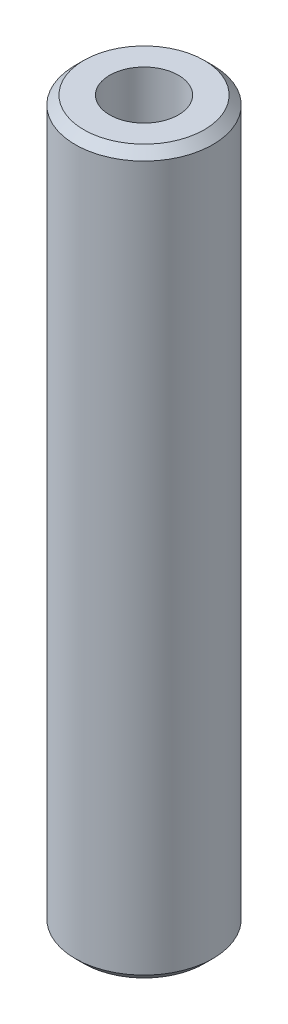
ISO-10303-21;
HEADER;
FILE_DESCRIPTION(('STEP AP214'),'2;1');
FILE_NAME('part.step','',(''),(''),'','','');
FILE_SCHEMA(('AUTOMOTIVE_DESIGN { 1 0 10303 214 1 1 1 1 }'));
ENDSEC;
DATA;
#1=APPLICATION_CONTEXT('core data for automotive mechanical design processes');
#2=APPLICATION_PROTOCOL_DEFINITION('international standard','automotive_design',2000,#1);
#3=PRODUCT_CONTEXT('',#1,'mechanical');
#4=PRODUCT('Part','Part','',(#3));
#5=PRODUCT_RELATED_PRODUCT_CATEGORY('part','',(#4));
#6=PRODUCT_DEFINITION_FORMATION('','',#4);
#7=PRODUCT_DEFINITION_CONTEXT('part definition',#1,'design');
#8=PRODUCT_DEFINITION('design','',#6,#7);
#9=PRODUCT_DEFINITION_SHAPE('','',#8);
#10=(LENGTH_UNIT() NAMED_UNIT(*) SI_UNIT(.MILLI.,.METRE.));
#11=(NAMED_UNIT(*) PLANE_ANGLE_UNIT() SI_UNIT($,.RADIAN.));
#12=(NAMED_UNIT(*) SI_UNIT($,.STERADIAN.) SOLID_ANGLE_UNIT());
#13=UNCERTAINTY_MEASURE_WITH_UNIT(LENGTH_MEASURE(1.E-05),#10,'distance_accuracy_value','');
#14=(GEOMETRIC_REPRESENTATION_CONTEXT(3) GLOBAL_UNCERTAINTY_ASSIGNED_CONTEXT((#13)) GLOBAL_UNIT_ASSIGNED_CONTEXT((#10,
#11,#12)) REPRESENTATION_CONTEXT('',''));
#15=CARTESIAN_POINT('',(0.,0.,0.));
#16=DIRECTION('',(0.,0.,1.));
#17=DIRECTION('',(1.,0.,0.));
#18=AXIS2_PLACEMENT_3D('',#15,#16,#17);
#19=CARTESIAN_POINT('',(0.,42.,0.));
#20=DIRECTION('',(0.,1.,0.));
#21=DIRECTION('',(0.,0.,1.));
#22=AXIS2_PLACEMENT_3D('',#19,#20,#21);
#23=PLANE('',#22);
#24=CARTESIAN_POINT('',(0.,42.,0.));
#25=DIRECTION('',(0.,1.,0.));
#26=DIRECTION('',(0.,0.,1.));
#27=AXIS2_PLACEMENT_3D('',#24,#25,#26);
#28=CIRCLE('',#27,3.50000000000003);
#29=CARTESIAN_POINT('',(0.,42.,3.50000000000003));
#30=VERTEX_POINT('',#29);
#31=EDGE_CURVE('E10',#30,#30,#28,.T.);
#32=ORIENTED_EDGE('',*,*,#31,.T.);
#33=EDGE_LOOP('',(#32));
#34=FACE_BOUND('',#33,.T.);
#35=CARTESIAN_POINT('',(0.,42.,0.));
#36=DIRECTION('',(0.,1.,0.));
#37=DIRECTION('',(0.,0.,1.));
#38=AXIS2_PLACEMENT_3D('',#35,#36,#37);
#39=CIRCLE('',#38,2.);
#40=CARTESIAN_POINT('',(0.,42.,-2.));
#41=VERTEX_POINT('',#40);
#42=EDGE_CURVE('E54',#41,#41,#39,.T.);
#43=ORIENTED_EDGE('',*,*,#42,.F.);
#44=EDGE_LOOP('',(#43));
#45=FACE_BOUND('',#44,.T.);
#46=ADVANCED_FACE('F33',(#34,#45),#23,.T.);
#47=CARTESIAN_POINT('',(0.,0.,0.));
#48=DIRECTION('',(0.,1.,0.));
#49=DIRECTION('',(0.,0.,1.));
#50=AXIS2_PLACEMENT_3D('',#47,#48,#49);
#51=PLANE('',#50);
#52=CARTESIAN_POINT('',(0.,0.,0.));
#53=DIRECTION('',(0.,1.,0.));
#54=DIRECTION('',(0.,0.,1.));
#55=AXIS2_PLACEMENT_3D('',#52,#53,#54);
#56=CIRCLE('',#55,3.49999999999997);
#57=CARTESIAN_POINT('',(0.,0.,3.49999999999997));
#58=VERTEX_POINT('',#57);
#59=EDGE_CURVE('E41',#58,#58,#56,.F.);
#60=ORIENTED_EDGE('',*,*,#59,.T.);
#61=EDGE_LOOP('',(#60));
#62=FACE_BOUND('',#61,.T.);
#63=CARTESIAN_POINT('',(0.,0.,0.));
#64=DIRECTION('',(0.,1.,0.));
#65=DIRECTION('',(0.,0.,1.));
#66=AXIS2_PLACEMENT_3D('',#63,#64,#65);
#67=CIRCLE('',#66,2.);
#68=CARTESIAN_POINT('',(0.,0.,-2.));
#69=VERTEX_POINT('',#68);
#70=EDGE_CURVE('E55',#69,#69,#67,.T.);
#71=ORIENTED_EDGE('',*,*,#70,.T.);
#72=EDGE_LOOP('',(#71));
#73=FACE_BOUND('',#72,.T.);
#74=ADVANCED_FACE('F65',(#62,#73),#51,.F.);
#75=CARTESIAN_POINT('',(0.,42.,0.));
#76=DIRECTION('',(0.,-1.,0.));
#77=DIRECTION('',(0.,0.,-1.));
#78=AXIS2_PLACEMENT_3D('',#75,#76,#77);
#79=CYLINDRICAL_SURFACE('',#78,4.);
#80=CARTESIAN_POINT('',(0.,0.500000000000028,0.));
#81=DIRECTION('',(0.,1.,0.));
#82=DIRECTION('',(0.,0.,1.));
#83=AXIS2_PLACEMENT_3D('',#80,#81,#82);
#84=CIRCLE('',#83,4.);
#85=CARTESIAN_POINT('',(0.,0.500000000000028,-4.));
#86=VERTEX_POINT('',#85);
#87=EDGE_CURVE('E45',#86,#86,#84,.T.);
#88=CARTESIAN_POINT('',(0.,41.5,0.));
#89=DIRECTION('',(0.,1.,0.));
#90=DIRECTION('',(0.,0.,1.));
#91=AXIS2_PLACEMENT_3D('',#88,#89,#90);
#92=CIRCLE('',#91,4.);
#93=CARTESIAN_POINT('',(0.,41.5,-4.));
#94=VERTEX_POINT('',#93);
#95=EDGE_CURVE('E49',#94,#94,#92,.F.);
#96=CARTESIAN_POINT('',(0.,0.500000000000028,-4.));
#97=CARTESIAN_POINT('',(0.,0.92708333333336,-4.));
#98=CARTESIAN_POINT('',(0.,1.35416666666669,-4.));
#99=CARTESIAN_POINT('',(0.,2.20833333333336,-4.));
#100=CARTESIAN_POINT('',(0.,2.6354166666667,-4.));
#101=CARTESIAN_POINT('',(0.,3.48958333333336,-4.));
#102=CARTESIAN_POINT('',(0.,3.9166666666667,-4.));
#103=CARTESIAN_POINT('',(0.,4.77083333333336,-4.));
#104=CARTESIAN_POINT('',(0.,5.1979166666667,-4.));
#105=CARTESIAN_POINT('',(0.,6.05208333333337,-4.));
#106=CARTESIAN_POINT('',(0.,6.4791666666667,-4.));
#107=CARTESIAN_POINT('',(0.,7.33333333333336,-4.));
#108=CARTESIAN_POINT('',(0.,7.7604166666667,-4.));
#109=CARTESIAN_POINT('',(0.,8.61458333333336,-4.));
#110=CARTESIAN_POINT('',(0.,9.04166666666669,-4.));
#111=CARTESIAN_POINT('',(0.,9.89583333333336,-4.));
#112=CARTESIAN_POINT('',(0.,10.3229166666667,-4.));
#113=CARTESIAN_POINT('',(0.,11.1770833333334,-4.));
#114=CARTESIAN_POINT('',(0.,11.6041666666667,-4.));
#115=CARTESIAN_POINT('',(0.,12.4583333333334,-4.));
#116=CARTESIAN_POINT('',(0.,12.8854166666667,-4.));
#117=CARTESIAN_POINT('',(0.,13.7395833333334,-4.));
#118=CARTESIAN_POINT('',(0.,14.1666666666667,-4.));
#119=CARTESIAN_POINT('',(0.,15.0208333333334,-4.));
#120=CARTESIAN_POINT('',(0.,15.4479166666667,-4.));
#121=CARTESIAN_POINT('',(0.,16.3020833333334,-4.));
#122=CARTESIAN_POINT('',(0.,16.7291666666667,-4.));
#123=CARTESIAN_POINT('',(0.,17.5833333333334,-4.));
#124=CARTESIAN_POINT('',(0.,18.0104166666667,-4.));
#125=CARTESIAN_POINT('',(0.,18.8645833333334,-4.));
#126=CARTESIAN_POINT('',(0.,19.2916666666667,-4.));
#127=CARTESIAN_POINT('',(0.,20.1458333333334,-4.));
#128=CARTESIAN_POINT('',(0.,20.5729166666667,-4.));
#129=CARTESIAN_POINT('',(0.,21.4270833333334,-4.));
#130=CARTESIAN_POINT('',(0.,21.8541666666667,-4.));
#131=CARTESIAN_POINT('',(0.,22.7083333333334,-4.));
#132=CARTESIAN_POINT('',(0.,23.1354166666667,-4.));
#133=CARTESIAN_POINT('',(0.,23.9895833333334,-4.));
#134=CARTESIAN_POINT('',(0.,24.4166666666667,-4.));
#135=CARTESIAN_POINT('',(0.,25.2708333333334,-4.));
#136=CARTESIAN_POINT('',(0.,25.6979166666667,-4.));
#137=CARTESIAN_POINT('',(0.,26.5520833333334,-4.));
#138=CARTESIAN_POINT('',(0.,26.9791666666667,-4.));
#139=CARTESIAN_POINT('',(0.,27.8333333333334,-4.));
#140=CARTESIAN_POINT('',(0.,28.2604166666667,-4.));
#141=CARTESIAN_POINT('',(0.,29.1145833333334,-4.));
#142=CARTESIAN_POINT('',(0.,29.5416666666667,-4.));
#143=CARTESIAN_POINT('',(0.,30.3958333333334,-4.));
#144=CARTESIAN_POINT('',(0.,30.8229166666667,-4.));
#145=CARTESIAN_POINT('',(0.,31.6770833333334,-4.));
#146=CARTESIAN_POINT('',(0.,32.1041666666667,-4.));
#147=CARTESIAN_POINT('',(0.,32.9583333333334,-4.));
#148=CARTESIAN_POINT('',(0.,33.3854166666667,-4.));
#149=CARTESIAN_POINT('',(0.,34.2395833333334,-4.));
#150=CARTESIAN_POINT('',(0.,34.6666666666667,-4.));
#151=CARTESIAN_POINT('',(0.,35.5208333333334,-4.));
#152=CARTESIAN_POINT('',(0.,35.9479166666667,-4.));
#153=CARTESIAN_POINT('',(0.,36.8020833333334,-4.));
#154=CARTESIAN_POINT('',(0.,37.2291666666667,-4.));
#155=CARTESIAN_POINT('',(0.,38.0833333333334,-4.));
#156=CARTESIAN_POINT('',(0.,38.5104166666667,-4.));
#157=CARTESIAN_POINT('',(0.,39.3645833333334,-4.));
#158=CARTESIAN_POINT('',(0.,39.7916666666667,-4.));
#159=CARTESIAN_POINT('',(0.,40.6458333333334,-4.));
#160=CARTESIAN_POINT('',(0.,41.0729166666667,-4.));
#161=CARTESIAN_POINT('',(0.,41.5,-4.));
#162=B_SPLINE_CURVE_WITH_KNOTS('',3,(#96,#97,#98,#99,#100,#101,#102,#103,#104,#105,#106,#107,
#108,#109,#110,#111,#112,#113,#114,#115,#116,#117,#118,#119,#120,#121,#122,#123,#124,#125,#126,
#127,#128,#129,#130,#131,#132,#133,#134,#135,#136,#137,#138,#139,#140,#141,#142,#143,#144,#145,
#146,#147,#148,#149,#150,#151,#152,#153,#154,#155,#156,#157,#158,#159,#160,#161),.UNSPECIFIED.,
.F.,.F.,(4,2,2,2,2,2,2,2,2,2,2,2,2,2,2,2,2,2,2,2,2,2,2,2,2,2,2,2,2,2,2,2,4),(0.,1.28125,2.5625,
3.84375,5.125,6.40625,7.6875,8.96875,10.25,11.53125,12.8125,14.09375,15.375,16.65625,17.9375,
19.21875,20.5,21.78125,23.0625,24.34375,25.625,26.90625,28.1875,29.46875,30.75,32.03125,33.3125,
34.59375,35.875,37.15625,38.4375,39.71875,41.),.UNSPECIFIED.);
#163=EDGE_CURVE('BSEAM70',#86,#94,#162,.T.);
#164=ORIENTED_EDGE('',*,*,#87,.T.);
#165=ORIENTED_EDGE('',*,*,#95,.T.);
#166=ORIENTED_EDGE('',*,*,#163,.T.);
#167=ORIENTED_EDGE('',*,*,#163,.F.);
#168=EDGE_LOOP('',(#164,#166,#165,#167));
#169=FACE_BOUND('',#168,.T.);
#170=ADVANCED_FACE('F70',(#169),#79,.T.);
#171=CARTESIAN_POINT('',(0.,42.,0.));
#172=DIRECTION('',(0.,-1.,0.));
#173=DIRECTION('',(0.,0.,-1.));
#174=AXIS2_PLACEMENT_3D('',#171,#172,#173);
#175=CYLINDRICAL_SURFACE('',#174,2.);
#176=CARTESIAN_POINT('',(0.,42.,-2.));
#177=CARTESIAN_POINT('',(0.,41.5625,-2.));
#178=CARTESIAN_POINT('',(0.,41.125,-2.));
#179=CARTESIAN_POINT('',(0.,40.25,-2.));
#180=CARTESIAN_POINT('',(0.,39.8125,-2.));
#181=CARTESIAN_POINT('',(0.,38.9375,-2.));
#182=CARTESIAN_POINT('',(0.,38.5,-2.));
#183=CARTESIAN_POINT('',(0.,37.625,-2.));
#184=CARTESIAN_POINT('',(0.,37.1875,-2.));
#185=CARTESIAN_POINT('',(0.,36.3125,-2.));
#186=CARTESIAN_POINT('',(0.,35.875,-2.));
#187=CARTESIAN_POINT('',(0.,35.,-2.));
#188=CARTESIAN_POINT('',(0.,34.5625,-2.));
#189=CARTESIAN_POINT('',(0.,33.6875,-2.));
#190=CARTESIAN_POINT('',(0.,33.25,-2.));
#191=CARTESIAN_POINT('',(0.,32.375,-2.));
#192=CARTESIAN_POINT('',(0.,31.9375,-2.));
#193=CARTESIAN_POINT('',(0.,31.0625,-2.));
#194=CARTESIAN_POINT('',(0.,30.625,-2.));
#195=CARTESIAN_POINT('',(0.,29.75,-2.));
#196=CARTESIAN_POINT('',(0.,29.3125,-2.));
#197=CARTESIAN_POINT('',(0.,28.4375,-2.));
#198=CARTESIAN_POINT('',(0.,28.,-2.));
#199=CARTESIAN_POINT('',(0.,27.125,-2.));
#200=CARTESIAN_POINT('',(0.,26.6875,-2.));
#201=CARTESIAN_POINT('',(0.,25.8125,-2.));
#202=CARTESIAN_POINT('',(0.,25.375,-2.));
#203=CARTESIAN_POINT('',(0.,24.5,-2.));
#204=CARTESIAN_POINT('',(0.,24.0625,-2.));
#205=CARTESIAN_POINT('',(0.,23.1875,-2.));
#206=CARTESIAN_POINT('',(0.,22.75,-2.));
#207=CARTESIAN_POINT('',(0.,21.875,-2.));
#208=CARTESIAN_POINT('',(0.,21.4375,-2.));
#209=CARTESIAN_POINT('',(0.,20.5625,-2.));
#210=CARTESIAN_POINT('',(0.,20.125,-2.));
#211=CARTESIAN_POINT('',(0.,19.25,-2.));
#212=CARTESIAN_POINT('',(0.,18.8125,-2.));
#213=CARTESIAN_POINT('',(0.,17.9375,-2.));
#214=CARTESIAN_POINT('',(0.,17.5,-2.));
#215=CARTESIAN_POINT('',(0.,16.625,-2.));
#216=CARTESIAN_POINT('',(0.,16.1875,-2.));
#217=CARTESIAN_POINT('',(0.,15.3125,-2.));
#218=CARTESIAN_POINT('',(0.,14.875,-2.));
#219=CARTESIAN_POINT('',(0.,14.,-2.));
#220=CARTESIAN_POINT('',(0.,13.5625,-2.));
#221=CARTESIAN_POINT('',(0.,12.6875,-2.));
#222=CARTESIAN_POINT('',(0.,12.25,-2.));
#223=CARTESIAN_POINT('',(0.,11.375,-2.));
#224=CARTESIAN_POINT('',(0.,10.9375,-2.));
#225=CARTESIAN_POINT('',(0.,10.0625,-2.));
#226=CARTESIAN_POINT('',(0.,9.625,-2.));
#227=CARTESIAN_POINT('',(0.,8.75,-2.));
#228=CARTESIAN_POINT('',(0.,8.3125,-2.));
#229=CARTESIAN_POINT('',(0.,7.4375,-2.));
#230=CARTESIAN_POINT('',(0.,7.,-2.));
#231=CARTESIAN_POINT('',(0.,6.125,-2.));
#232=CARTESIAN_POINT('',(0.,5.6875,-2.));
#233=CARTESIAN_POINT('',(0.,4.8125,-2.));
#234=CARTESIAN_POINT('',(0.,4.375,-2.));
#235=CARTESIAN_POINT('',(0.,3.5,-2.));
#236=CARTESIAN_POINT('',(0.,3.0625,-2.));
#237=CARTESIAN_POINT('',(0.,2.1875,-2.));
#238=CARTESIAN_POINT('',(0.,1.75,-2.));
#239=CARTESIAN_POINT('',(0.,0.875000000000001,-2.));
#240=CARTESIAN_POINT('',(0.,0.4375,-2.));
#241=CARTESIAN_POINT('',(0.,0.,-2.));
#242=B_SPLINE_CURVE_WITH_KNOTS('',3,(#176,#177,#178,#179,#180,#181,#182,#183,#184,#185,#186,
#187,#188,#189,#190,#191,#192,#193,#194,#195,#196,#197,#198,#199,#200,#201,#202,#203,#204,#205,
#206,#207,#208,#209,#210,#211,#212,#213,#214,#215,#216,#217,#218,#219,#220,#221,#222,#223,#224,
#225,#226,#227,#228,#229,#230,#231,#232,#233,#234,#235,#236,#237,#238,#239,#240,#241),
.UNSPECIFIED.,.F.,.F.,(4,2,2,2,2,2,2,2,2,2,2,2,2,2,2,2,2,2,2,2,2,2,2,2,2,2,2,2,2,2,2,2,4),(0.,
1.31249999999999,2.625,3.9375,5.25,6.5625,7.87499999999999,9.18749999999999,10.5,11.8125,13.125,
14.4375,15.75,17.0625,18.375,19.6875,21.,22.3125,23.625,24.9375,26.25,27.5625,28.875,30.1875,
31.5,32.8125,34.125,35.4375,36.75,38.0625,39.375,40.6875,42.),.UNSPECIFIED.);
#243=EDGE_CURVE('BSEAM61',#41,#69,#242,.T.);
#244=ORIENTED_EDGE('',*,*,#42,.T.);
#245=ORIENTED_EDGE('',*,*,#70,.F.);
#246=ORIENTED_EDGE('',*,*,#243,.T.);
#247=ORIENTED_EDGE('',*,*,#243,.F.);
#248=EDGE_LOOP('',(#244,#246,#245,#247));
#249=FACE_BOUND('',#248,.T.);
#250=ADVANCED_FACE('F61',(#249),#175,.F.);
#251=CARTESIAN_POINT('',(0.,0.500000000000028,0.));
#252=DIRECTION('',(0.,1.,0.));
#253=DIRECTION('',(0.,0.,1.));
#254=AXIS2_PLACEMENT_3D('',#251,#252,#253);
#255=CONICAL_SURFACE('',#254,4.,0.785398163397446);
#256=ORIENTED_EDGE('',*,*,#59,.F.);
#257=EDGE_LOOP('',(#256));
#258=FACE_BOUND('',#257,.T.);
#259=ORIENTED_EDGE('',*,*,#87,.F.);
#260=EDGE_LOOP('',(#259));
#261=FACE_BOUND('',#260,.T.);
#262=ADVANCED_FACE('F77',(#258,#261),#255,.T.);
#263=CARTESIAN_POINT('',(0.,42.,0.));
#264=DIRECTION('',(0.,-1.,0.));
#265=DIRECTION('',(0.,0.,-1.));
#266=AXIS2_PLACEMENT_3D('',#263,#264,#265);
#267=CONICAL_SURFACE('',#266,3.50000000000003,0.785398163397446);
#268=ORIENTED_EDGE('',*,*,#95,.F.);
#269=EDGE_LOOP('',(#268));
#270=FACE_BOUND('',#269,.T.);
#271=ORIENTED_EDGE('',*,*,#31,.F.);
#272=EDGE_LOOP('',(#271));
#273=FACE_BOUND('',#272,.T.);
#274=ADVANCED_FACE('F36',(#270,#273),#267,.T.);
#275=CLOSED_SHELL('',(#46,#74,#170,#250,#262,#274));
#276=MANIFOLD_SOLID_BREP('B2',#275);
#277=ADVANCED_BREP_SHAPE_REPRESENTATION('',(#18,#276),#14);
#278=SHAPE_DEFINITION_REPRESENTATION(#9,#277);
ENDSEC;
END-ISO-10303-21;
